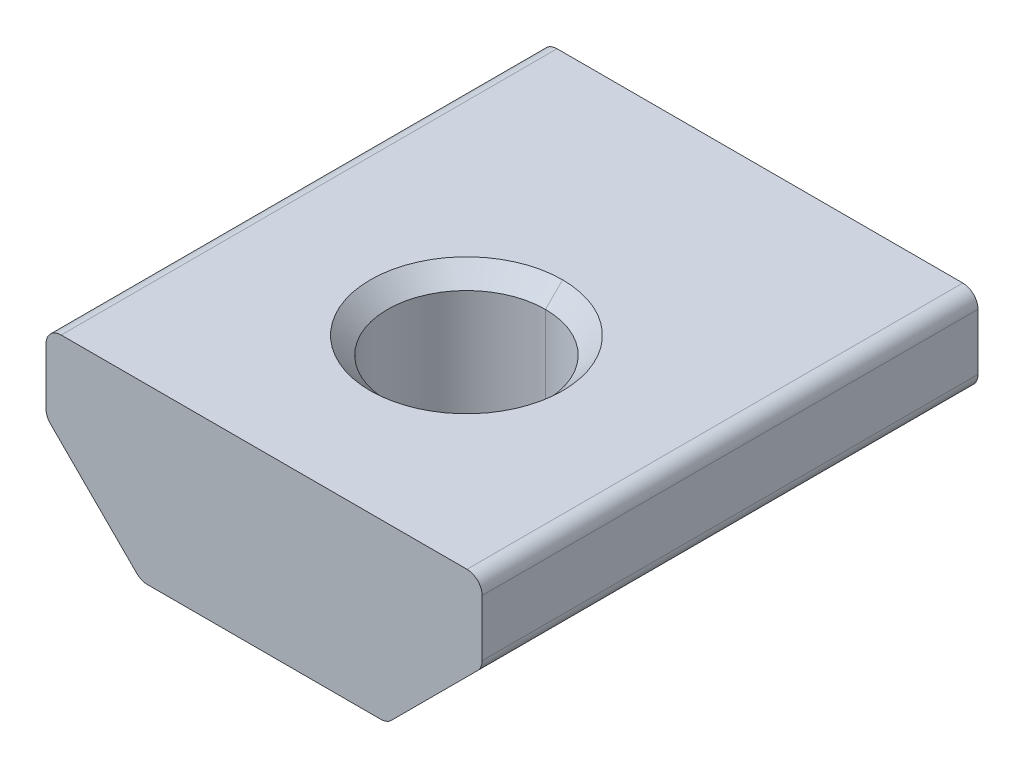
ISO-10303-21;
HEADER;
FILE_DESCRIPTION(('STEP AP214'),'2;1');
FILE_NAME('part.step','',(''),(''),'','','');
FILE_SCHEMA(('AUTOMOTIVE_DESIGN { 1 0 10303 214 1 1 1 1 }'));
ENDSEC;
DATA;
#1=APPLICATION_CONTEXT('core data for automotive mechanical design processes');
#2=APPLICATION_PROTOCOL_DEFINITION('international standard','automotive_design',2000,#1);
#3=PRODUCT_CONTEXT('',#1,'mechanical');
#4=PRODUCT('Part','Part','',(#3));
#5=PRODUCT_RELATED_PRODUCT_CATEGORY('part','',(#4));
#6=PRODUCT_DEFINITION_FORMATION('','',#4);
#7=PRODUCT_DEFINITION_CONTEXT('part definition',#1,'design');
#8=PRODUCT_DEFINITION('design','',#6,#7);
#9=PRODUCT_DEFINITION_SHAPE('','',#8);
#10=(LENGTH_UNIT() NAMED_UNIT(*) SI_UNIT(.MILLI.,.METRE.));
#11=(NAMED_UNIT(*) PLANE_ANGLE_UNIT() SI_UNIT($,.RADIAN.));
#12=(NAMED_UNIT(*) SI_UNIT($,.STERADIAN.) SOLID_ANGLE_UNIT());
#13=UNCERTAINTY_MEASURE_WITH_UNIT(LENGTH_MEASURE(1.E-05),#10,'distance_accuracy_value','');
#14=(GEOMETRIC_REPRESENTATION_CONTEXT(3) GLOBAL_UNCERTAINTY_ASSIGNED_CONTEXT((#13)) GLOBAL_UNIT_ASSIGNED_CONTEXT((#10,
#11,#12)) REPRESENTATION_CONTEXT('',''));
#15=CARTESIAN_POINT('',(0.,0.,0.));
#16=DIRECTION('',(0.,0.,1.));
#17=DIRECTION('',(1.,0.,0.));
#18=AXIS2_PLACEMENT_3D('',#15,#16,#17);
#19=CARTESIAN_POINT('',(-5.09269999999998,3.96240000000009,5.07999999999992));
#20=DIRECTION('',(0.,0.,-0.999999999999986));
#21=DIRECTION('',(0.707106781186543,-0.707106781186547,0.));
#22=AXIS2_PLACEMENT_3D('',#19,#20,#21);
#23=CYLINDRICAL_SURFACE('',#22,0.380999999999912);
#24=CARTESIAN_POINT('',(-5.09270000000006,3.96240000000009,-7.36600000000008));
#25=DIRECTION('',(0.,0.,0.999999999999986));
#26=DIRECTION('',(0.999999999999986,0.,0.));
#27=AXIS2_PLACEMENT_3D('',#24,#25,#26);
#28=CIRCLE('',#27,0.380999999999912);
#29=CARTESIAN_POINT('',(-5.09270000000001,4.3434,-7.36600000000001));
#30=VERTEX_POINT('',#29);
#31=CARTESIAN_POINT('',(-5.4737,3.96240000000001,-7.36600000000003));
#32=VERTEX_POINT('',#31);
#33=EDGE_CURVE('E11',#30,#32,#28,.T.);
#34=ORIENTED_EDGE('',*,*,#33,.T.);
#35=DIRECTION('',(0.,0.,-0.999999999999986));
#36=VECTOR('',#35,1.);
#37=CARTESIAN_POINT('',(-5.47369999999991,3.96240000000001,5.07999999999996));
#38=LINE('',#37,#36);
#39=CARTESIAN_POINT('',(-5.47369999999991,3.96240000000001,5.07999999999996));
#40=VERTEX_POINT('',#39);
#41=EDGE_CURVE('E25',#40,#32,#38,.T.);
#42=ORIENTED_EDGE('',*,*,#41,.F.);
#43=CARTESIAN_POINT('',(-5.09269999999998,3.96240000000009,5.07999999999992));
#44=DIRECTION('',(0.,0.,0.999999999999986));
#45=DIRECTION('',(0.999999999999986,0.,0.));
#46=AXIS2_PLACEMENT_3D('',#43,#44,#45);
#47=CIRCLE('',#46,0.380999999999912);
#48=CARTESIAN_POINT('',(-5.09269999999995,4.3434,5.07999999999997));
#49=VERTEX_POINT('',#48);
#50=EDGE_CURVE('E374',#49,#40,#47,.T.);
#51=ORIENTED_EDGE('',*,*,#50,.F.);
#52=DIRECTION('',(0.,0.,-0.999999999999986));
#53=VECTOR('',#52,1.);
#54=CARTESIAN_POINT('',(-5.09269999999995,4.3434,5.07999999999997));
#55=LINE('',#54,#53);
#56=EDGE_CURVE('E370',#49,#30,#55,.T.);
#57=ORIENTED_EDGE('',*,*,#56,.T.);
#58=EDGE_LOOP('',(#34,#42,#51,#57));
#59=FACE_BOUND('',#58,.T.);
#60=ADVANCED_FACE('F17',(#59),#23,.T.);
#61=CARTESIAN_POINT('',(5.09270000000067,4.3434,5.07999999999997));
#62=DIRECTION('',(0.,-1.,0.));
#63=DIRECTION('',(0.,0.,-0.999999999999986));
#64=AXIS2_PLACEMENT_3D('',#61,#62,#63);
#65=PLANE('',#64);
#66=CARTESIAN_POINT('',(0.,4.3434,0.));
#67=DIRECTION('',(0.,-1.,0.));
#68=DIRECTION('',(0.,0.,-0.999999999999986));
#69=AXIS2_PLACEMENT_3D('',#66,#67,#68);
#70=CIRCLE('',#69,2.413);
#71=CARTESIAN_POINT('',(0.,4.3434,-2.41300000000003));
#72=VERTEX_POINT('',#71);
#73=CARTESIAN_POINT('',(0.,4.3434,2.413));
#74=VERTEX_POINT('',#73);
#75=EDGE_CURVE('E161',#72,#74,#70,.T.);
#76=ORIENTED_EDGE('',*,*,#75,.T.);
#77=CARTESIAN_POINT('',(0.,4.3434,0.));
#78=DIRECTION('',(0.,-1.,0.));
#79=DIRECTION('',(0.,0.,-0.999999999999986));
#80=AXIS2_PLACEMENT_3D('',#77,#78,#79);
#81=CIRCLE('',#80,2.413);
#82=EDGE_CURVE('E363',#74,#72,#81,.T.);
#83=ORIENTED_EDGE('',*,*,#82,.T.);
#84=EDGE_LOOP('',(#76,#83));
#85=FACE_BOUND('',#84,.T.);
#86=DIRECTION('',(-0.999999999999986,0.,0.));
#87=VECTOR('',#86,1.);
#88=CARTESIAN_POINT('',(5.09270000000064,4.3434,-7.36600000000001));
#89=LINE('',#88,#87);
#90=CARTESIAN_POINT('',(5.09270000000064,4.3434,-7.36600000000001));
#91=VERTEX_POINT('',#90);
#92=EDGE_CURVE('E358',#91,#30,#89,.T.);
#93=ORIENTED_EDGE('',*,*,#92,.T.);
#94=ORIENTED_EDGE('',*,*,#56,.F.);
#95=DIRECTION('',(-0.999999999999986,0.,0.));
#96=VECTOR('',#95,1.);
#97=CARTESIAN_POINT('',(5.09270000000067,4.3434,5.07999999999997));
#98=LINE('',#97,#96);
#99=CARTESIAN_POINT('',(5.09270000000067,4.3434,5.07999999999997));
#100=VERTEX_POINT('',#99);
#101=EDGE_CURVE('E353',#100,#49,#98,.T.);
#102=ORIENTED_EDGE('',*,*,#101,.F.);
#103=DIRECTION('',(0.,0.,-0.999999999999986));
#104=VECTOR('',#103,1.);
#105=CARTESIAN_POINT('',(5.09270000000067,4.3434,5.07999999999997));
#106=LINE('',#105,#104);
#107=EDGE_CURVE('E349',#100,#91,#106,.T.);
#108=ORIENTED_EDGE('',*,*,#107,.T.);
#109=EDGE_LOOP('',(#93,#94,#102,#108));
#110=FACE_BOUND('',#109,.T.);
#111=ADVANCED_FACE('F391',(#85,#110),#65,.F.);
#112=CARTESIAN_POINT('',(5.09270000000073,3.96240000000009,5.08));
#113=DIRECTION('',(0.,0.,-0.999999999999986));
#114=DIRECTION('',(-0.707106781186544,-0.707106781186546,0.));
#115=AXIS2_PLACEMENT_3D('',#112,#113,#114);
#116=CYLINDRICAL_SURFACE('',#115,0.380999999999912);
#117=CARTESIAN_POINT('',(5.09270000000084,3.96240000000009,-7.36600000000012));
#118=DIRECTION('',(0.,0.,0.999999999999986));
#119=DIRECTION('',(0.999999999999986,0.,0.));
#120=AXIS2_PLACEMENT_3D('',#117,#118,#119);
#121=CIRCLE('',#120,0.380999999999912);
#122=CARTESIAN_POINT('',(5.47370000000064,3.96240000000001,-7.36600000000001));
#123=VERTEX_POINT('',#122);
#124=EDGE_CURVE('E344',#123,#91,#121,.T.);
#125=ORIENTED_EDGE('',*,*,#124,.T.);
#126=ORIENTED_EDGE('',*,*,#107,.F.);
#127=CARTESIAN_POINT('',(5.09270000000073,3.96240000000009,5.08));
#128=DIRECTION('',(0.,0.,0.999999999999986));
#129=DIRECTION('',(0.999999999999986,0.,0.));
#130=AXIS2_PLACEMENT_3D('',#127,#128,#129);
#131=CIRCLE('',#130,0.380999999999912);
#132=CARTESIAN_POINT('',(5.47370000000069,3.96240000000001,5.08000000000003));
#133=VERTEX_POINT('',#132);
#134=EDGE_CURVE('E339',#133,#100,#131,.T.);
#135=ORIENTED_EDGE('',*,*,#134,.F.);
#136=DIRECTION('',(0.,0.,-0.999999999999986));
#137=VECTOR('',#136,1.);
#138=CARTESIAN_POINT('',(5.47370000000069,3.96240000000001,5.08000000000003));
#139=LINE('',#138,#137);
#140=EDGE_CURVE('E335',#133,#123,#139,.T.);
#141=ORIENTED_EDGE('',*,*,#140,.T.);
#142=EDGE_LOOP('',(#125,#126,#135,#141));
#143=FACE_BOUND('',#142,.T.);
#144=ADVANCED_FACE('F429',(#143),#116,.T.);
#145=CARTESIAN_POINT('',(5.47370000000069,2.5466853672641,5.08000000000003));
#146=DIRECTION('',(-0.999999999999986,0.,0.));
#147=DIRECTION('',(0.,0.,0.999999999999986));
#148=AXIS2_PLACEMENT_3D('',#145,#146,#147);
#149=PLANE('',#148);
#150=DIRECTION('',(0.,1.,0.));
#151=VECTOR('',#150,1.);
#152=CARTESIAN_POINT('',(5.47370000000064,2.5466853672641,-7.36600000000001));
#153=LINE('',#152,#151);
#154=CARTESIAN_POINT('',(5.47370000000064,2.5466853672641,-7.36600000000001));
#155=VERTEX_POINT('',#154);
#156=EDGE_CURVE('E330',#155,#123,#153,.T.);
#157=ORIENTED_EDGE('',*,*,#156,.T.);
#158=ORIENTED_EDGE('',*,*,#140,.F.);
#159=DIRECTION('',(0.,1.,0.));
#160=VECTOR('',#159,1.);
#161=CARTESIAN_POINT('',(5.47370000000069,2.5466853672641,5.08000000000003));
#162=LINE('',#161,#160);
#163=CARTESIAN_POINT('',(5.47370000000069,2.5466853672641,5.08000000000003));
#164=VERTEX_POINT('',#163);
#165=EDGE_CURVE('E325',#164,#133,#162,.T.);
#166=ORIENTED_EDGE('',*,*,#165,.F.);
#167=DIRECTION('',(0.,0.,-0.999999999999986));
#168=VECTOR('',#167,1.);
#169=CARTESIAN_POINT('',(5.47370000000069,2.5466853672641,5.08000000000003));
#170=LINE('',#169,#168);
#171=EDGE_CURVE('E321',#164,#155,#170,.T.);
#172=ORIENTED_EDGE('',*,*,#171,.T.);
#173=EDGE_LOOP('',(#157,#158,#166,#172));
#174=FACE_BOUND('',#173,.T.);
#175=ADVANCED_FACE('F427',(#174),#149,.F.);
#176=CARTESIAN_POINT('',(5.09270000000051,2.54668536726424,5.07999999999999));
#177=DIRECTION('',(0.,0.,-0.999999999999987));
#178=DIRECTION('',(-0.923879532511336,0.382683432364935,0.));
#179=AXIS2_PLACEMENT_3D('',#176,#177,#178);
#180=CYLINDRICAL_SURFACE('',#179,0.381000000000225);
#181=CARTESIAN_POINT('',(5.09270000000042,2.54668536726424,-7.36600000000003));
#182=DIRECTION('',(0.,0.,0.999999999999986));
#183=DIRECTION('',(0.999999999999986,0.,0.));
#184=AXIS2_PLACEMENT_3D('',#181,#182,#183);
#185=CIRCLE('',#184,0.381000000000225);
#186=CARTESIAN_POINT('',(5.36210768363277,2.27727768363209,-7.36600000000012));
#187=VERTEX_POINT('',#186);
#188=EDGE_CURVE('E316',#187,#155,#185,.T.);
#189=ORIENTED_EDGE('',*,*,#188,.T.);
#190=ORIENTED_EDGE('',*,*,#171,.F.);
#191=CARTESIAN_POINT('',(5.09270000000051,2.54668536726424,5.07999999999999));
#192=DIRECTION('',(0.,0.,0.999999999999986));
#193=DIRECTION('',(0.999999999999986,0.,0.));
#194=AXIS2_PLACEMENT_3D('',#191,#192,#193);
#195=CIRCLE('',#194,0.381000000000225);
#196=CARTESIAN_POINT('',(5.36210768363274,2.27727768363209,5.08));
#197=VERTEX_POINT('',#196);
#198=EDGE_CURVE('E311',#197,#164,#195,.T.);
#199=ORIENTED_EDGE('',*,*,#198,.F.);
#200=DIRECTION('',(0.,0.,-0.999999999999986));
#201=VECTOR('',#200,1.);
#202=CARTESIAN_POINT('',(5.36210768363274,2.27727768363209,5.08));
#203=LINE('',#202,#201);
#204=EDGE_CURVE('E307',#197,#187,#203,.T.);
#205=ORIENTED_EDGE('',*,*,#204,.T.);
#206=EDGE_LOOP('',(#189,#190,#199,#205));
#207=FACE_BOUND('',#206,.T.);
#208=ADVANCED_FACE('F422',(#207),#180,.T.);
#209=CARTESIAN_POINT('',(3.19642231636802,0.111592316367926,5.07999999999995));
#210=DIRECTION('',(-0.707106781186537,0.707106781186553,0.));
#211=DIRECTION('',(-0.707106781186547,-0.707106781186543,0.));
#212=AXIS2_PLACEMENT_3D('',#209,#210,#211);
#213=PLANE('',#212);
#214=DIRECTION('',(0.707106781186547,0.707106781186543,0.));
#215=VECTOR('',#214,1.);
#216=CARTESIAN_POINT('',(3.19642231636791,0.111592316367926,-7.36600000000005));
#217=LINE('',#216,#215);
#218=CARTESIAN_POINT('',(3.19642231636791,0.111592316367926,-7.36600000000005));
#219=VERTEX_POINT('',#218);
#220=EDGE_CURVE('E302',#219,#187,#217,.T.);
#221=ORIENTED_EDGE('',*,*,#220,.T.);
#222=ORIENTED_EDGE('',*,*,#204,.F.);
#223=DIRECTION('',(0.707106781186547,0.707106781186543,0.));
#224=VECTOR('',#223,1.);
#225=CARTESIAN_POINT('',(3.19642231636802,0.111592316367926,5.07999999999995));
#226=LINE('',#225,#224);
#227=CARTESIAN_POINT('',(3.19642231636802,0.111592316367926,5.07999999999995));
#228=VERTEX_POINT('',#227);
#229=EDGE_CURVE('E297',#228,#197,#226,.T.);
#230=ORIENTED_EDGE('',*,*,#229,.F.);
#231=DIRECTION('',(0.,0.,-0.999999999999986));
#232=VECTOR('',#231,1.);
#233=CARTESIAN_POINT('',(3.19642231636802,0.111592316367926,5.07999999999995));
#234=LINE('',#233,#232);
#235=EDGE_CURVE('E293',#228,#219,#234,.T.);
#236=ORIENTED_EDGE('',*,*,#235,.T.);
#237=EDGE_LOOP('',(#221,#222,#230,#236));
#238=FACE_BOUND('',#237,.T.);
#239=ADVANCED_FACE('F419',(#238),#213,.F.);
#240=CARTESIAN_POINT('',(2.9270146327359,0.381000000000076,5.07999999999992));
#241=DIRECTION('',(0.,0.,-0.999999999999986));
#242=DIRECTION('',(-0.382683432365066,0.923879532511293,0.));
#243=AXIS2_PLACEMENT_3D('',#240,#241,#242);
#244=CYLINDRICAL_SURFACE('',#243,0.381000000000084);
#245=CARTESIAN_POINT('',(2.92701463273581,0.381000000000076,-7.366));
#246=DIRECTION('',(0.,0.,0.999999999999986));
#247=DIRECTION('',(0.999999999999986,0.,0.));
#248=AXIS2_PLACEMENT_3D('',#245,#246,#247);
#249=CIRCLE('',#248,0.381000000000084);
#250=CARTESIAN_POINT('',(2.92701463273581,0.,-7.366));
#251=VERTEX_POINT('',#250);
#252=EDGE_CURVE('E288',#251,#219,#249,.T.);
#253=ORIENTED_EDGE('',*,*,#252,.T.);
#254=ORIENTED_EDGE('',*,*,#235,.F.);
#255=CARTESIAN_POINT('',(2.9270146327359,0.381000000000076,5.07999999999992));
#256=DIRECTION('',(0.,0.,0.999999999999986));
#257=DIRECTION('',(0.999999999999986,0.,0.));
#258=AXIS2_PLACEMENT_3D('',#255,#256,#257);
#259=CIRCLE('',#258,0.381000000000084);
#260=CARTESIAN_POINT('',(2.9270146327359,0.,5.07999999999992));
#261=VERTEX_POINT('',#260);
#262=EDGE_CURVE('E283',#261,#228,#259,.T.);
#263=ORIENTED_EDGE('',*,*,#262,.F.);
#264=DIRECTION('',(0.,0.,-0.999999999999986));
#265=VECTOR('',#264,1.);
#266=CARTESIAN_POINT('',(2.9270146327359,0.,5.07999999999992));
#267=LINE('',#266,#265);
#268=EDGE_CURVE('E279',#261,#251,#267,.T.);
#269=ORIENTED_EDGE('',*,*,#268,.T.);
#270=EDGE_LOOP('',(#253,#254,#263,#269));
#271=FACE_BOUND('',#270,.T.);
#272=ADVANCED_FACE('F416',(#271),#244,.T.);
#273=CARTESIAN_POINT('',(-2.92701463273581,0.,5.07999999999999));
#274=DIRECTION('',(0.,1.,0.));
#275=DIRECTION('',(0.,0.,0.999999999999986));
#276=AXIS2_PLACEMENT_3D('',#273,#274,#275);
#277=PLANE('',#276);
#278=CARTESIAN_POINT('',(0.,0.,0.));
#279=DIRECTION('',(0.,-1.,0.));
#280=DIRECTION('',(0.,0.,-0.999999999999986));
#281=AXIS2_PLACEMENT_3D('',#278,#279,#280);
#282=CIRCLE('',#281,2.413);
#283=CARTESIAN_POINT('',(0.,0.,2.413));
#284=VERTEX_POINT('',#283);
#285=CARTESIAN_POINT('',(0.,0.,-2.41300000000003));
#286=VERTEX_POINT('',#285);
#287=EDGE_CURVE('E274',#284,#286,#282,.T.);
#288=ORIENTED_EDGE('',*,*,#287,.F.);
#289=CARTESIAN_POINT('',(0.,0.,0.));
#290=DIRECTION('',(0.,-1.,0.));
#291=DIRECTION('',(0.,0.,-0.999999999999986));
#292=AXIS2_PLACEMENT_3D('',#289,#290,#291);
#293=CIRCLE('',#292,2.413);
#294=EDGE_CURVE('E269',#286,#284,#293,.T.);
#295=ORIENTED_EDGE('',*,*,#294,.F.);
#296=EDGE_LOOP('',(#288,#295));
#297=FACE_BOUND('',#296,.T.);
#298=DIRECTION('',(0.999999999999986,0.,0.));
#299=VECTOR('',#298,1.);
#300=CARTESIAN_POINT('',(-2.9270146327359,0.,-7.36600000000003));
#301=LINE('',#300,#299);
#302=CARTESIAN_POINT('',(-2.9270146327359,0.,-7.36600000000003));
#303=VERTEX_POINT('',#302);
#304=EDGE_CURVE('E264',#303,#251,#301,.T.);
#305=ORIENTED_EDGE('',*,*,#304,.T.);
#306=ORIENTED_EDGE('',*,*,#268,.F.);
#307=DIRECTION('',(0.999999999999986,0.,0.));
#308=VECTOR('',#307,1.);
#309=CARTESIAN_POINT('',(-2.92701463273581,0.,5.07999999999999));
#310=LINE('',#309,#308);
#311=CARTESIAN_POINT('',(-2.92701463273581,0.,5.07999999999999));
#312=VERTEX_POINT('',#311);
#313=EDGE_CURVE('E259',#312,#261,#310,.T.);
#314=ORIENTED_EDGE('',*,*,#313,.F.);
#315=DIRECTION('',(0.,0.,-0.999999999999986));
#316=VECTOR('',#315,1.);
#317=CARTESIAN_POINT('',(-2.92701463273581,0.,5.07999999999999));
#318=LINE('',#317,#316);
#319=EDGE_CURVE('E255',#312,#303,#318,.T.);
#320=ORIENTED_EDGE('',*,*,#319,.T.);
#321=EDGE_LOOP('',(#305,#306,#314,#320));
#322=FACE_BOUND('',#321,.T.);
#323=ADVANCED_FACE('F410',(#297,#322),#277,.F.);
#324=CARTESIAN_POINT('',(-2.92701463273595,0.380999999999687,5.08));
#325=DIRECTION('',(0.,0.,-0.999999999999986));
#326=DIRECTION('',(0.382683432365154,0.923879532511257,0.));
#327=AXIS2_PLACEMENT_3D('',#324,#325,#326);
#328=CYLINDRICAL_SURFACE('',#327,0.380999999999679);
#329=CARTESIAN_POINT('',(-2.92701463273598,0.380999999999687,-7.36600000000004));
#330=DIRECTION('',(0.,0.,0.999999999999986));
#331=DIRECTION('',(0.999999999999986,0.,0.));
#332=AXIS2_PLACEMENT_3D('',#329,#330,#331);
#333=CIRCLE('',#332,0.380999999999679);
#334=CARTESIAN_POINT('',(-3.19642231636791,0.111592316367926,-7.36600000000001));
#335=VERTEX_POINT('',#334);
#336=EDGE_CURVE('E250',#335,#303,#333,.T.);
#337=ORIENTED_EDGE('',*,*,#336,.T.);
#338=ORIENTED_EDGE('',*,*,#319,.F.);
#339=CARTESIAN_POINT('',(-2.92701463273595,0.380999999999687,5.08));
#340=DIRECTION('',(0.,0.,0.999999999999986));
#341=DIRECTION('',(0.999999999999986,0.,0.));
#342=AXIS2_PLACEMENT_3D('',#339,#340,#341);
#343=CIRCLE('',#342,0.380999999999679);
#344=CARTESIAN_POINT('',(-3.19642231636791,0.111592316367926,5.08000000000002));
#345=VERTEX_POINT('',#344);
#346=EDGE_CURVE('E245',#345,#312,#343,.T.);
#347=ORIENTED_EDGE('',*,*,#346,.F.);
#348=DIRECTION('',(0.,0.,-0.999999999999986));
#349=VECTOR('',#348,1.);
#350=CARTESIAN_POINT('',(-3.19642231636791,0.111592316367926,5.08000000000002));
#351=LINE('',#350,#349);
#352=EDGE_CURVE('E241',#345,#335,#351,.T.);
#353=ORIENTED_EDGE('',*,*,#352,.T.);
#354=EDGE_LOOP('',(#337,#338,#347,#353));
#355=FACE_BOUND('',#354,.T.);
#356=ADVANCED_FACE('F407',(#355),#328,.T.);
#357=CARTESIAN_POINT('',(-5.3621076836321,2.27727768363209,5.08));
#358=DIRECTION('',(0.707106781186539,0.707106781186551,0.));
#359=DIRECTION('',(-0.707106781186546,0.707106781186544,0.));
#360=AXIS2_PLACEMENT_3D('',#357,#358,#359);
#361=PLANE('',#360);
#362=DIRECTION('',(0.707106781186546,-0.707106781186544,0.));
#363=VECTOR('',#362,1.);
#364=CARTESIAN_POINT('',(-5.3621076836321,2.27727768363209,-7.36600000000001));
#365=LINE('',#364,#363);
#366=CARTESIAN_POINT('',(-5.3621076836321,2.27727768363209,-7.36600000000001));
#367=VERTEX_POINT('',#366);
#368=EDGE_CURVE('E236',#367,#335,#365,.T.);
#369=ORIENTED_EDGE('',*,*,#368,.T.);
#370=ORIENTED_EDGE('',*,*,#352,.F.);
#371=DIRECTION('',(0.707106781186546,-0.707106781186544,0.));
#372=VECTOR('',#371,1.);
#373=CARTESIAN_POINT('',(-5.3621076836321,2.27727768363209,5.08));
#374=LINE('',#373,#372);
#375=CARTESIAN_POINT('',(-5.3621076836321,2.27727768363209,5.08));
#376=VERTEX_POINT('',#375);
#377=EDGE_CURVE('E231',#376,#345,#374,.T.);
#378=ORIENTED_EDGE('',*,*,#377,.F.);
#379=DIRECTION('',(0.,0.,-0.999999999999986));
#380=VECTOR('',#379,1.);
#381=CARTESIAN_POINT('',(-5.3621076836321,2.27727768363209,5.08));
#382=LINE('',#381,#380);
#383=EDGE_CURVE('E227',#376,#367,#382,.T.);
#384=ORIENTED_EDGE('',*,*,#383,.T.);
#385=EDGE_LOOP('',(#369,#370,#378,#384));
#386=FACE_BOUND('',#385,.T.);
#387=ADVANCED_FACE('F405',(#386),#361,.F.);
#388=CARTESIAN_POINT('',(-5.09270000000017,2.54668536726405,5.07999999999999));
#389=DIRECTION('',(0.,0.,-0.999999999999986));
#390=DIRECTION('',(0.923879532511316,0.382683432364985,0.));
#391=AXIS2_PLACEMENT_3D('',#388,#389,#390);
#392=CYLINDRICAL_SURFACE('',#391,0.380999999999762);
#393=CARTESIAN_POINT('',(-5.09270000000023,2.54668536726405,-7.36600000000001));
#394=DIRECTION('',(0.,0.,0.999999999999986));
#395=DIRECTION('',(0.999999999999986,0.,0.));
#396=AXIS2_PLACEMENT_3D('',#393,#394,#395);
#397=CIRCLE('',#396,0.380999999999762);
#398=CARTESIAN_POINT('',(-5.4737,2.54668536726421,-7.36600000000003));
#399=VERTEX_POINT('',#398);
#400=EDGE_CURVE('E222',#399,#367,#397,.T.);
#401=ORIENTED_EDGE('',*,*,#400,.T.);
#402=ORIENTED_EDGE('',*,*,#383,.F.);
#403=CARTESIAN_POINT('',(-5.09270000000017,2.54668536726405,5.07999999999999));
#404=DIRECTION('',(0.,0.,0.999999999999986));
#405=DIRECTION('',(0.999999999999986,0.,0.));
#406=AXIS2_PLACEMENT_3D('',#403,#404,#405);
#407=CIRCLE('',#406,0.380999999999762);
#408=CARTESIAN_POINT('',(-5.47369999999991,2.54668536726421,5.07999999999996));
#409=VERTEX_POINT('',#408);
#410=EDGE_CURVE('E217',#409,#376,#407,.T.);
#411=ORIENTED_EDGE('',*,*,#410,.F.);
#412=DIRECTION('',(0.,0.,-0.999999999999986));
#413=VECTOR('',#412,1.);
#414=CARTESIAN_POINT('',(-5.47369999999991,2.54668536726421,5.07999999999996));
#415=LINE('',#414,#413);
#416=EDGE_CURVE('E213',#409,#399,#415,.T.);
#417=ORIENTED_EDGE('',*,*,#416,.T.);
#418=EDGE_LOOP('',(#401,#402,#411,#417));
#419=FACE_BOUND('',#418,.T.);
#420=ADVANCED_FACE('F401',(#419),#392,.T.);
#421=CARTESIAN_POINT('',(-5.47369999999991,3.96240000000001,5.07999999999996));
#422=DIRECTION('',(0.999999999999986,0.,0.));
#423=DIRECTION('',(0.,0.,-0.999999999999986));
#424=AXIS2_PLACEMENT_3D('',#421,#422,#423);
#425=PLANE('',#424);
#426=DIRECTION('',(0.,-1.,0.));
#427=VECTOR('',#426,1.);
#428=CARTESIAN_POINT('',(-5.4737,3.96240000000001,-7.36600000000003));
#429=LINE('',#428,#427);
#430=EDGE_CURVE('E208',#32,#399,#429,.T.);
#431=ORIENTED_EDGE('',*,*,#430,.T.);
#432=ORIENTED_EDGE('',*,*,#416,.F.);
#433=DIRECTION('',(0.,-1.,0.));
#434=VECTOR('',#433,1.);
#435=CARTESIAN_POINT('',(-5.47369999999991,3.96240000000001,5.07999999999996));
#436=LINE('',#435,#434);
#437=EDGE_CURVE('E203',#40,#409,#436,.T.);
#438=ORIENTED_EDGE('',*,*,#437,.F.);
#439=ORIENTED_EDGE('',*,*,#41,.T.);
#440=EDGE_LOOP('',(#431,#432,#438,#439));
#441=FACE_BOUND('',#440,.T.);
#442=ADVANCED_FACE('F384',(#441),#425,.F.);
#443=CARTESIAN_POINT('',(-5.09269999999998,3.96240000000009,5.07999999999992));
#444=DIRECTION('',(0.,0.,0.999999999999986));
#445=DIRECTION('',(0.999999999999986,0.,0.));
#446=AXIS2_PLACEMENT_3D('',#443,#444,#445);
#447=PLANE('',#446);
#448=ORIENTED_EDGE('',*,*,#50,.T.);
#449=ORIENTED_EDGE('',*,*,#437,.T.);
#450=ORIENTED_EDGE('',*,*,#410,.T.);
#451=ORIENTED_EDGE('',*,*,#377,.T.);
#452=ORIENTED_EDGE('',*,*,#346,.T.);
#453=ORIENTED_EDGE('',*,*,#313,.T.);
#454=ORIENTED_EDGE('',*,*,#262,.T.);
#455=ORIENTED_EDGE('',*,*,#229,.T.);
#456=ORIENTED_EDGE('',*,*,#198,.T.);
#457=ORIENTED_EDGE('',*,*,#165,.T.);
#458=ORIENTED_EDGE('',*,*,#134,.T.);
#459=ORIENTED_EDGE('',*,*,#101,.T.);
#460=EDGE_LOOP('',(#448,#449,#450,#451,#452,#453,#454,#455,#456,#457,#458,#459));
#461=FACE_BOUND('',#460,.T.);
#462=ADVANCED_FACE('F388',(#461),#447,.T.);
#463=CARTESIAN_POINT('',(-5.09270000000006,3.96240000000009,-7.36600000000008));
#464=DIRECTION('',(0.,0.,0.999999999999986));
#465=DIRECTION('',(0.999999999999986,0.,0.));
#466=AXIS2_PLACEMENT_3D('',#463,#464,#465);
#467=PLANE('',#466);
#468=ORIENTED_EDGE('',*,*,#33,.F.);
#469=ORIENTED_EDGE('',*,*,#92,.F.);
#470=ORIENTED_EDGE('',*,*,#124,.F.);
#471=ORIENTED_EDGE('',*,*,#156,.F.);
#472=ORIENTED_EDGE('',*,*,#188,.F.);
#473=ORIENTED_EDGE('',*,*,#220,.F.);
#474=ORIENTED_EDGE('',*,*,#252,.F.);
#475=ORIENTED_EDGE('',*,*,#304,.F.);
#476=ORIENTED_EDGE('',*,*,#336,.F.);
#477=ORIENTED_EDGE('',*,*,#368,.F.);
#478=ORIENTED_EDGE('',*,*,#400,.F.);
#479=ORIENTED_EDGE('',*,*,#430,.F.);
#480=EDGE_LOOP('',(#468,#469,#470,#471,#472,#473,#474,#475,#476,#477,#478,#479));
#481=FACE_BOUND('',#480,.T.);
#482=ADVANCED_FACE('F396',(#481),#467,.F.);
#483=CARTESIAN_POINT('',(0.,0.429259999999987,0.));
#484=DIRECTION('',(0.,-1.,0.));
#485=DIRECTION('',(-0.999999999999987,0.,0.));
#486=AXIS2_PLACEMENT_3D('',#483,#484,#485);
#487=CONICAL_SURFACE('',#486,1.98374,0.785398163397448);
#488=DIRECTION('',(0.,-0.707106781186548,0.707106781186541));
#489=VECTOR('',#488,1.);
#490=CARTESIAN_POINT('',(0.,0.429259999999987,1.98374000000001));
#491=LINE('',#490,#489);
#492=CARTESIAN_POINT('',(0.,0.429259999999987,1.98374000000001));
#493=VERTEX_POINT('',#492);
#494=EDGE_CURVE('E198',#493,#284,#491,.T.);
#495=ORIENTED_EDGE('',*,*,#494,.F.);
#496=CARTESIAN_POINT('',(0.,0.429259999999987,0.));
#497=DIRECTION('',(0.,-1.,0.));
#498=DIRECTION('',(0.,0.,-0.999999999999986));
#499=AXIS2_PLACEMENT_3D('',#496,#497,#498);
#500=CIRCLE('',#499,1.98374);
#501=CARTESIAN_POINT('',(0.,0.429259999999987,-1.98374000000003));
#502=VERTEX_POINT('',#501);
#503=EDGE_CURVE('E194',#502,#493,#500,.T.);
#504=ORIENTED_EDGE('',*,*,#503,.F.);
#505=DIRECTION('',(0.,-0.707106781186548,-0.707106781186542));
#506=VECTOR('',#505,1.);
#507=CARTESIAN_POINT('',(0.,0.429259999999987,-1.98374000000003));
#508=LINE('',#507,#506);
#509=EDGE_CURVE('E189',#502,#286,#508,.T.);
#510=ORIENTED_EDGE('',*,*,#509,.T.);
#511=ORIENTED_EDGE('',*,*,#294,.T.);
#512=EDGE_LOOP('',(#495,#504,#510,#511));
#513=FACE_BOUND('',#512,.T.);
#514=ADVANCED_FACE('F546',(#513),#487,.F.);
#515=CARTESIAN_POINT('',(0.,0.429259999999987,0.));
#516=DIRECTION('',(0.,-1.,0.));
#517=DIRECTION('',(0.999999999999986,0.,0.));
#518=AXIS2_PLACEMENT_3D('',#515,#516,#517);
#519=CONICAL_SURFACE('',#518,1.98374,0.785398163397448);
#520=ORIENTED_EDGE('',*,*,#494,.T.);
#521=ORIENTED_EDGE('',*,*,#287,.T.);
#522=ORIENTED_EDGE('',*,*,#509,.F.);
#523=CARTESIAN_POINT('',(0.,0.429259999999987,0.));
#524=DIRECTION('',(0.,-1.,0.));
#525=DIRECTION('',(0.,0.,-0.999999999999986));
#526=AXIS2_PLACEMENT_3D('',#523,#524,#525);
#527=CIRCLE('',#526,1.98374);
#528=CARTESIAN_POINT('',(-0.613009372421369,0.429259999999987,1.88664885363533));
#529=VERTEX_POINT('',#528);
#530=EDGE_CURVE('E151',#529,#502,#527,.T.);
#531=ORIENTED_EDGE('',*,*,#530,.F.);
#532=CARTESIAN_POINT('',(0.,0.429259999999987,0.));
#533=DIRECTION('',(0.,-1.,0.));
#534=DIRECTION('',(0.,0.,-0.999999999999986));
#535=AXIS2_PLACEMENT_3D('',#532,#533,#534);
#536=CIRCLE('',#535,1.98374);
#537=EDGE_CURVE('E181',#493,#529,#536,.T.);
#538=ORIENTED_EDGE('',*,*,#537,.F.);
#539=EDGE_LOOP('',(#520,#521,#522,#531,#538));
#540=FACE_BOUND('',#539,.T.);
#541=ADVANCED_FACE('F555',(#540),#519,.F.);
#542=CARTESIAN_POINT('',(0.,0.,0.));
#543=DIRECTION('',(0.,-1.,0.));
#544=DIRECTION('',(-0.987688340595124,0.,-0.156434465040229));
#545=AXIS2_PLACEMENT_3D('',#542,#543,#544);
#546=CYLINDRICAL_SURFACE('',#545,1.98374);
#547=DIRECTION('',(0.,-1.,0.));
#548=VECTOR('',#547,1.);
#549=CARTESIAN_POINT('',(-0.613009372421369,3.91414000000001,1.88664885363533));
#550=LINE('',#549,#548);
#551=CARTESIAN_POINT('',(-0.613009372421369,3.91414000000001,1.88664885363533));
#552=VERTEX_POINT('',#551);
#553=EDGE_CURVE('E177',#552,#529,#550,.T.);
#554=ORIENTED_EDGE('',*,*,#553,.F.);
#555=CARTESIAN_POINT('',(0.,3.91414000000001,0.));
#556=DIRECTION('',(0.,-1.,0.));
#557=DIRECTION('',(0.,0.,-0.999999999999986));
#558=AXIS2_PLACEMENT_3D('',#555,#556,#557);
#559=CIRCLE('',#558,1.98374);
#560=CARTESIAN_POINT('',(0.,3.91414000000001,1.98374000000001));
#561=VERTEX_POINT('',#560);
#562=EDGE_CURVE('E138',#561,#552,#559,.T.);
#563=ORIENTED_EDGE('',*,*,#562,.F.);
#564=CARTESIAN_POINT('',(0.,3.91414000000001,0.));
#565=DIRECTION('',(0.,-1.,0.));
#566=DIRECTION('',(0.,0.,-0.999999999999986));
#567=AXIS2_PLACEMENT_3D('',#564,#565,#566);
#568=CIRCLE('',#567,1.98374);
#569=CARTESIAN_POINT('',(0.,3.91414000000001,-1.98374000000003));
#570=VERTEX_POINT('',#569);
#571=EDGE_CURVE('E132',#570,#561,#568,.T.);
#572=ORIENTED_EDGE('',*,*,#571,.F.);
#573=DIRECTION('',(0.,-1.,0.));
#574=VECTOR('',#573,1.);
#575=CARTESIAN_POINT('',(0.,3.91414000000001,-1.98374000000003));
#576=LINE('',#575,#574);
#577=EDGE_CURVE('E136',#570,#502,#576,.T.);
#578=ORIENTED_EDGE('',*,*,#577,.T.);
#579=ORIENTED_EDGE('',*,*,#503,.T.);
#580=ORIENTED_EDGE('',*,*,#537,.T.);
#581=EDGE_LOOP('',(#554,#563,#572,#578,#579,#580));
#582=FACE_BOUND('',#581,.T.);
#583=ADVANCED_FACE('F134',(#582),#546,.F.);
#584=CARTESIAN_POINT('',(0.,0.,0.));
#585=DIRECTION('',(0.,-1.,0.));
#586=DIRECTION('',(0.987688340595124,0.,0.156434465040229));
#587=AXIS2_PLACEMENT_3D('',#584,#585,#586);
#588=CYLINDRICAL_SURFACE('',#587,1.98374);
#589=ORIENTED_EDGE('',*,*,#553,.T.);
#590=ORIENTED_EDGE('',*,*,#530,.T.);
#591=ORIENTED_EDGE('',*,*,#577,.F.);
#592=CARTESIAN_POINT('',(0.,3.91414000000001,0.));
#593=DIRECTION('',(0.,-1.,0.));
#594=DIRECTION('',(0.,0.,-0.999999999999986));
#595=AXIS2_PLACEMENT_3D('',#592,#593,#594);
#596=CIRCLE('',#595,1.98374);
#597=EDGE_CURVE('E150',#552,#570,#596,.T.);
#598=ORIENTED_EDGE('',*,*,#597,.F.);
#599=EDGE_LOOP('',(#589,#590,#591,#598));
#600=FACE_BOUND('',#599,.T.);
#601=ADVANCED_FACE('F149',(#600),#588,.F.);
#602=CARTESIAN_POINT('',(0.,4.3434,0.));
#603=DIRECTION('',(0.,1.,0.));
#604=DIRECTION('',(0.999999999999987,0.,0.));
#605=AXIS2_PLACEMENT_3D('',#602,#603,#604);
#606=CONICAL_SURFACE('',#605,2.413,0.785398163397448);
#607=DIRECTION('',(0.,0.707106781186548,-0.707106781186542));
#608=VECTOR('',#607,1.);
#609=CARTESIAN_POINT('',(0.,3.91414000000001,-1.98374000000003));
#610=LINE('',#609,#608);
#611=EDGE_CURVE('E157',#570,#72,#610,.T.);
#612=ORIENTED_EDGE('',*,*,#611,.T.);
#613=ORIENTED_EDGE('',*,*,#82,.F.);
#614=DIRECTION('',(0.,0.707106781186548,0.707106781186542));
#615=VECTOR('',#614,1.);
#616=CARTESIAN_POINT('',(0.,3.91414000000001,1.98374000000001));
#617=LINE('',#616,#615);
#618=EDGE_CURVE('E162',#561,#74,#617,.T.);
#619=ORIENTED_EDGE('',*,*,#618,.F.);
#620=ORIENTED_EDGE('',*,*,#562,.T.);
#621=ORIENTED_EDGE('',*,*,#597,.T.);
#622=EDGE_LOOP('',(#612,#613,#619,#620,#621));
#623=FACE_BOUND('',#622,.T.);
#624=ADVANCED_FACE('F155',(#623),#606,.F.);
#625=CARTESIAN_POINT('',(0.,4.3434,0.));
#626=DIRECTION('',(0.,1.,0.));
#627=DIRECTION('',(-0.999999999999986,0.,0.));
#628=AXIS2_PLACEMENT_3D('',#625,#626,#627);
#629=CONICAL_SURFACE('',#628,2.413,0.785398163397448);
#630=ORIENTED_EDGE('',*,*,#611,.F.);
#631=ORIENTED_EDGE('',*,*,#571,.T.);
#632=ORIENTED_EDGE('',*,*,#618,.T.);
#633=ORIENTED_EDGE('',*,*,#75,.F.);
#634=EDGE_LOOP('',(#630,#631,#632,#633));
#635=FACE_BOUND('',#634,.T.);
#636=ADVANCED_FACE('F160',(#635),#629,.F.);
#637=CLOSED_SHELL('',(#60,#111,#144,#175,#208,#239,#272,#323,#356,#387,#420,#442,#462,#482,#514,
#541,#583,#601,#624,#636));
#638=MANIFOLD_SOLID_BREP('B1',#637);
#639=ADVANCED_BREP_SHAPE_REPRESENTATION('',(#18,#638),#14);
#640=SHAPE_DEFINITION_REPRESENTATION(#9,#639);
ENDSEC;
END-ISO-10303-21;
